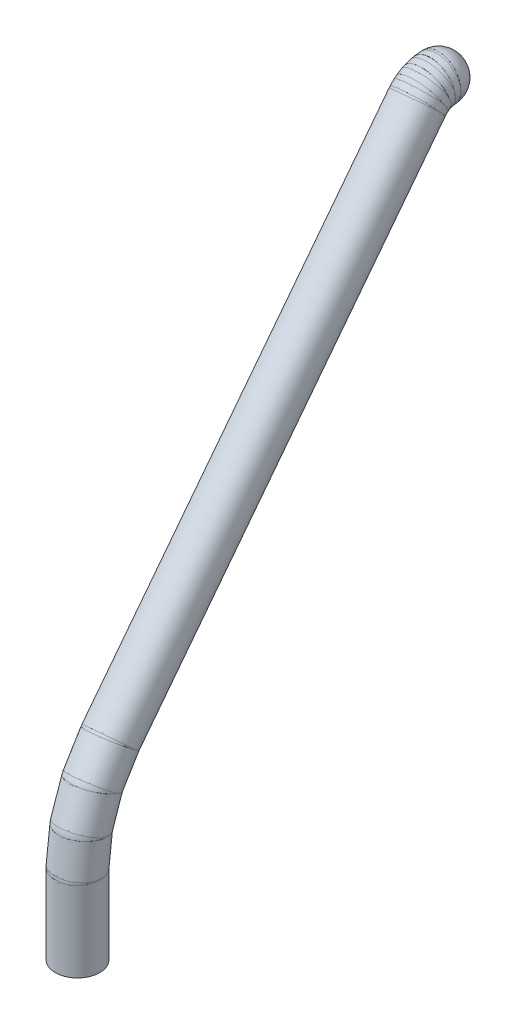
ISO-10303-21;
HEADER;
FILE_DESCRIPTION(('STEP AP214'),'2;1');
FILE_NAME('part.step','',(''),(''),'','','');
FILE_SCHEMA(('AUTOMOTIVE_DESIGN { 1 0 10303 214 1 1 1 1 }'));
ENDSEC;
DATA;
#1=APPLICATION_CONTEXT('core data for automotive mechanical design processes');
#2=APPLICATION_PROTOCOL_DEFINITION('international standard','automotive_design',2000,#1);
#3=PRODUCT_CONTEXT('',#1,'mechanical');
#4=PRODUCT('Part','Part','',(#3));
#5=PRODUCT_RELATED_PRODUCT_CATEGORY('part','',(#4));
#6=PRODUCT_DEFINITION_FORMATION('','',#4);
#7=PRODUCT_DEFINITION_CONTEXT('part definition',#1,'design');
#8=PRODUCT_DEFINITION('design','',#6,#7);
#9=PRODUCT_DEFINITION_SHAPE('','',#8);
#10=(LENGTH_UNIT() NAMED_UNIT(*) SI_UNIT(.MILLI.,.METRE.));
#11=(NAMED_UNIT(*) PLANE_ANGLE_UNIT() SI_UNIT($,.RADIAN.));
#12=(NAMED_UNIT(*) SI_UNIT($,.STERADIAN.) SOLID_ANGLE_UNIT());
#13=UNCERTAINTY_MEASURE_WITH_UNIT(LENGTH_MEASURE(1.E-05),#10,'distance_accuracy_value','');
#14=(GEOMETRIC_REPRESENTATION_CONTEXT(3) GLOBAL_UNCERTAINTY_ASSIGNED_CONTEXT((#13)) GLOBAL_UNIT_ASSIGNED_CONTEXT((#10,
#11,#12)) REPRESENTATION_CONTEXT('',''));
#15=CARTESIAN_POINT('',(0.,0.,0.));
#16=DIRECTION('',(0.,0.,1.));
#17=DIRECTION('',(1.,0.,0.));
#18=AXIS2_PLACEMENT_3D('',#15,#16,#17);
#19=CARTESIAN_POINT('',(30.,-101.2,256.));
#20=DIRECTION('',(0.,1.,0.));
#21=DIRECTION('',(1.,0.,0.));
#22=AXIS2_PLACEMENT_3D('',#19,#20,#21);
#23=PLANE('',#22);
#24=CARTESIAN_POINT('',(30.,-101.2,256.));
#25=DIRECTION('',(0.,1.,0.));
#26=DIRECTION('',(0.,0.,1.));
#27=AXIS2_PLACEMENT_3D('',#24,#25,#26);
#28=CIRCLE('',#27,2.5);
#29=CARTESIAN_POINT('',(30.,-101.2,258.5));
#30=VERTEX_POINT('',#29);
#31=EDGE_CURVE('P0_E10',#30,#30,#28,.T.);
#32=ORIENTED_EDGE('',*,*,#31,.F.);
#33=EDGE_LOOP('',(#32));
#34=FACE_BOUND('',#33,.T.);
#35=ADVANCED_FACE('P0_F15',(#34),#23,.F.);
#36=CARTESIAN_POINT('',(30.,-92.17247960699,256.));
#37=DIRECTION('',(0.,1.,0.));
#38=DIRECTION('',(1.,0.,0.));
#39=AXIS2_PLACEMENT_3D('',#36,#37,#38);
#40=PLANE('',#39);
#41=CARTESIAN_POINT('',(30.,-92.17247960699,256.));
#42=DIRECTION('',(0.,1.,0.));
#43=DIRECTION('',(0.,0.,1.));
#44=AXIS2_PLACEMENT_3D('',#41,#42,#43);
#45=CIRCLE('',#44,2.5);
#46=CARTESIAN_POINT('',(30.,-92.17247960699,258.5));
#47=VERTEX_POINT('',#46);
#48=EDGE_CURVE('P0_E39',#47,#47,#45,.T.);
#49=ORIENTED_EDGE('',*,*,#48,.T.);
#50=EDGE_LOOP('',(#49));
#51=FACE_BOUND('',#50,.T.);
#52=ADVANCED_FACE('P0_F42',(#51),#40,.T.);
#53=CARTESIAN_POINT('',(30.,-101.2,256.));
#54=DIRECTION('',(0.,1.,0.));
#55=DIRECTION('',(0.,0.,1.));
#56=AXIS2_PLACEMENT_3D('',#53,#54,#55);
#57=CYLINDRICAL_SURFACE('',#56,2.5);
#58=ORIENTED_EDGE('',*,*,#48,.F.);
#59=DIRECTION('',(0.,1.,0.));
#60=VECTOR('',#59,1.);
#61=CARTESIAN_POINT('',(30.,-101.2,258.5));
#62=LINE('',#61,#60);
#63=EDGE_CURVE('P0_E24',#30,#47,#62,.T.);
#64=ORIENTED_EDGE('',*,*,#63,.F.);
#65=ORIENTED_EDGE('',*,*,#31,.T.);
#66=ORIENTED_EDGE('',*,*,#63,.T.);
#67=EDGE_LOOP('',(#58,#64,#65,#66));
#68=FACE_BOUND('',#67,.T.);
#69=ADVANCED_FACE('P0_F17',(#68),#57,.T.);
#70=CLOSED_SHELL('',(#35,#52,#69));
#71=MANIFOLD_SOLID_BREP('P0_B1',#70);
#72=CARTESIAN_POINT('',(30.,-92.17247960699,256.));
#73=DIRECTION('',(-0.0126773422459009,0.992033754658075,-0.125332815386009));
#74=DIRECTION('',(-0.994923319263172,0.,0.100635921948139));
#75=AXIS2_PLACEMENT_3D('',#72,#73,#74);
#76=PLANE('',#75);
#77=CARTESIAN_POINT('',(30.,-92.17247960699,256.));
#78=DIRECTION('',(-0.0126773422459009,0.99203375465811,-0.125332815385731));
#79=DIRECTION('',(0.,0.125342888031981,0.992113481623852));
#80=AXIS2_PLACEMENT_3D('',#77,#78,#79);
#81=CIRCLE('',#80,2.5);
#82=CARTESIAN_POINT('',(30.,-91.85912238691,258.48028370406));
#83=VERTEX_POINT('',#82);
#84=EDGE_CURVE('P1_E11',#83,#83,#81,.T.);
#85=ORIENTED_EDGE('',*,*,#84,.F.);
#86=EDGE_LOOP('',(#85));
#87=FACE_BOUND('',#86,.T.);
#88=ADVANCED_FACE('P1_F16',(#87),#76,.F.);
#89=CARTESIAN_POINT('',(29.952090167216,-88.42341530158,255.52634597134));
#90=DIRECTION('',(-0.0126773422459009,0.992033754658075,-0.125332815386009));
#91=DIRECTION('',(-0.994923319263172,0.,0.100635921948139));
#92=AXIS2_PLACEMENT_3D('',#89,#90,#91);
#93=PLANE('',#92);
#94=CARTESIAN_POINT('',(29.952090167216,-88.42341530158,255.52634597134));
#95=DIRECTION('',(-0.0126773422459009,0.99203375465811,-0.125332815385731));
#96=DIRECTION('',(0.,0.125342888031981,0.992113481623852));
#97=AXIS2_PLACEMENT_3D('',#94,#95,#96);
#98=CIRCLE('',#97,2.5);
#99=CARTESIAN_POINT('',(29.952090167216,-88.1100580815,258.0066296754));
#100=VERTEX_POINT('',#99);
#101=EDGE_CURVE('P1_E41',#100,#100,#98,.T.);
#102=ORIENTED_EDGE('',*,*,#101,.T.);
#103=EDGE_LOOP('',(#102));
#104=FACE_BOUND('',#103,.T.);
#105=ADVANCED_FACE('P1_F18',(#104),#93,.T.);
#106=CARTESIAN_POINT('',(30.,-92.17247960699,256.));
#107=DIRECTION('',(-0.0126773422459009,0.99203375465811,-0.125332815385731));
#108=DIRECTION('',(0.,0.125342888031981,0.992113481623852));
#109=AXIS2_PLACEMENT_3D('',#106,#107,#108);
#110=CYLINDRICAL_SURFACE('',#109,2.5);
#111=ORIENTED_EDGE('',*,*,#101,.F.);
#112=DIRECTION('',(-0.0126773422459009,0.992033754658075,-0.125332815386009));
#113=VECTOR('',#112,1.);
#114=CARTESIAN_POINT('',(30.,-91.85912238691,258.48028370406));
#115=LINE('',#114,#113);
#116=EDGE_CURVE('P1_E25',#83,#100,#115,.T.);
#117=ORIENTED_EDGE('',*,*,#116,.F.);
#118=ORIENTED_EDGE('',*,*,#84,.T.);
#119=ORIENTED_EDGE('',*,*,#116,.T.);
#120=EDGE_LOOP('',(#111,#117,#118,#119));
#121=FACE_BOUND('',#120,.T.);
#122=ADVANCED_FACE('P1_F40',(#121),#110,.T.);
#123=CLOSED_SHELL('',(#88,#105,#122));
#124=MANIFOLD_SOLID_BREP('P1_B1',#123);
#125=CARTESIAN_POINT('',(29.952090167216,-88.42341530158,255.52634597134));
#126=DIRECTION('',(-0.0372273182593311,0.929063302515528,-0.368042805518813));
#127=DIRECTION('',(-0.994923319263152,0.,0.10063592194834));
#128=AXIS2_PLACEMENT_3D('',#125,#126,#127);
#129=PLANE('',#128);
#130=CARTESIAN_POINT('',(29.952090167216,-88.42341530158,255.52634597134));
#131=DIRECTION('',(-0.0372273182593311,0.929063302515526,-0.368042805518817));
#132=DIRECTION('',(0.,0.368298101239983,0.929707754416958));
#133=AXIS2_PLACEMENT_3D('',#130,#131,#132);
#134=CIRCLE('',#133,2.5);
#135=CARTESIAN_POINT('',(29.952090167216,-87.50267004848,257.85061535738));
#136=VERTEX_POINT('',#135);
#137=EDGE_CURVE('P2_E11',#136,#136,#134,.T.);
#138=ORIENTED_EDGE('',*,*,#137,.F.);
#139=EDGE_LOOP('',(#138));
#140=FACE_BOUND('',#139,.T.);
#141=ADVANCED_FACE('P2_F16',(#140),#129,.F.);
#142=CARTESIAN_POINT('',(29.811401799087,-84.9123270462,254.1354496046));
#143=DIRECTION('',(-0.0372273182593311,0.929063302515528,-0.368042805518813));
#144=DIRECTION('',(-0.994923319263152,0.,0.10063592194834));
#145=AXIS2_PLACEMENT_3D('',#142,#143,#144);
#146=PLANE('',#145);
#147=CARTESIAN_POINT('',(29.811401799087,-84.9123270462,254.1354496046));
#148=DIRECTION('',(-0.0372273182593311,0.929063302515526,-0.368042805518817));
#149=DIRECTION('',(0.,0.368298101239983,0.929707754416958));
#150=AXIS2_PLACEMENT_3D('',#147,#148,#149);
#151=CIRCLE('',#150,2.5);
#152=CARTESIAN_POINT('',(29.811401799087,-83.9915817931,256.45971899065));
#153=VERTEX_POINT('',#152);
#154=EDGE_CURVE('P2_E41',#153,#153,#151,.T.);
#155=ORIENTED_EDGE('',*,*,#154,.T.);
#156=EDGE_LOOP('',(#155));
#157=FACE_BOUND('',#156,.T.);
#158=ADVANCED_FACE('P2_F18',(#157),#146,.T.);
#159=CARTESIAN_POINT('',(29.952090167216,-88.42341530158,255.52634597134));
#160=DIRECTION('',(-0.0372273182593311,0.929063302515526,-0.368042805518817));
#161=DIRECTION('',(0.,0.368298101239983,0.929707754416958));
#162=AXIS2_PLACEMENT_3D('',#159,#160,#161);
#163=CYLINDRICAL_SURFACE('',#162,2.5);
#164=ORIENTED_EDGE('',*,*,#154,.F.);
#165=DIRECTION('',(-0.0372273182593311,0.929063302515528,-0.368042805518813));
#166=VECTOR('',#165,1.);
#167=CARTESIAN_POINT('',(29.952090167216,-87.50267004848,257.85061535738));
#168=LINE('',#167,#166);
#169=EDGE_CURVE('P2_E20',#136,#153,#168,.T.);
#170=ORIENTED_EDGE('',*,*,#169,.F.);
#171=ORIENTED_EDGE('',*,*,#137,.T.);
#172=ORIENTED_EDGE('',*,*,#169,.T.);
#173=EDGE_LOOP('',(#164,#170,#171,#172));
#174=FACE_BOUND('',#173,.T.);
#175=ADVANCED_FACE('P2_F40',(#174),#163,.T.);
#176=CLOSED_SHELL('',(#141,#158,#175));
#177=MANIFOLD_SOLID_BREP('P2_B1',#176);
#178=CARTESIAN_POINT('',(29.811401799087,-84.9123270462,254.1354496046));
#179=DIRECTION('',(-0.0594142486084648,0.807119518111336,-0.587390866924245));
#180=DIRECTION('',(-0.994923319263134,0.,0.100635921948515));
#181=AXIS2_PLACEMENT_3D('',#178,#179,#180);
#182=PLANE('',#181);
#183=CARTESIAN_POINT('',(29.811401799087,-84.9123270462,254.1354496046));
#184=DIRECTION('',(-0.0594142486084648,0.807119518111208,-0.587390866924421));
#185=DIRECTION('',(0.,0.588430380316118,0.808547888205163));
#186=AXIS2_PLACEMENT_3D('',#183,#184,#185);
#187=CIRCLE('',#186,2.5);
#188=CARTESIAN_POINT('',(29.811401799087,-83.44125109541,256.15681932512));
#189=VERTEX_POINT('',#188);
#190=EDGE_CURVE('P3_E11',#189,#189,#187,.T.);
#191=ORIENTED_EDGE('',*,*,#190,.F.);
#192=EDGE_LOOP('',(#191));
#193=FACE_BOUND('',#192,.T.);
#194=ADVANCED_FACE('P3_F16',(#193),#182,.F.);
#195=CARTESIAN_POINT('',(29.586865247135,-81.86208509492,251.91559960236));
#196=DIRECTION('',(-0.0594142486084648,0.807119518111336,-0.587390866924245));
#197=DIRECTION('',(-0.994923319263134,0.,0.100635921948515));
#198=AXIS2_PLACEMENT_3D('',#195,#196,#197);
#199=PLANE('',#198);
#200=CARTESIAN_POINT('',(29.586865247135,-81.86208509492,251.91559960236));
#201=DIRECTION('',(-0.0594142486084648,0.807119518111208,-0.587390866924421));
#202=DIRECTION('',(0.,0.588430380316118,0.808547888205163));
#203=AXIS2_PLACEMENT_3D('',#200,#201,#202);
#204=CIRCLE('',#203,2.5);
#205=CARTESIAN_POINT('',(29.586865247135,-80.39100914413,253.93696932287));
#206=VERTEX_POINT('',#205);
#207=EDGE_CURVE('P3_E40',#206,#206,#204,.T.);
#208=ORIENTED_EDGE('',*,*,#207,.T.);
#209=EDGE_LOOP('',(#208));
#210=FACE_BOUND('',#209,.T.);
#211=ADVANCED_FACE('P3_F44',(#210),#199,.T.);
#212=CARTESIAN_POINT('',(29.811401799087,-84.9123270462,254.1354496046));
#213=DIRECTION('',(-0.0594142486084648,0.807119518111208,-0.587390866924421));
#214=DIRECTION('',(0.,0.588430380316118,0.808547888205163));
#215=AXIS2_PLACEMENT_3D('',#212,#213,#214);
#216=CYLINDRICAL_SURFACE('',#215,2.5);
#217=ORIENTED_EDGE('',*,*,#207,.F.);
#218=DIRECTION('',(-0.0594142486084648,0.807119518111336,-0.587390866924245));
#219=VECTOR('',#218,1.);
#220=CARTESIAN_POINT('',(29.811401799087,-83.44125109541,256.15681932512));
#221=LINE('',#220,#219);
#222=EDGE_CURVE('P3_E25',#189,#206,#221,.T.);
#223=ORIENTED_EDGE('',*,*,#222,.F.);
#224=ORIENTED_EDGE('',*,*,#190,.T.);
#225=ORIENTED_EDGE('',*,*,#222,.T.);
#226=EDGE_LOOP('',(#217,#223,#224,#225));
#227=FACE_BOUND('',#226,.T.);
#228=ADVANCED_FACE('P3_F18',(#227),#216,.T.);
#229=CLOSED_SHELL('',(#194,#211,#228));
#230=MANIFOLD_SOLID_BREP('P3_B1',#229);
#231=CARTESIAN_POINT('',(29.586865247135,-81.86208509492,251.91559960236));
#232=DIRECTION('',(-0.0691730704917026,0.726317240162447,-0.683870128724421));
#233=DIRECTION('',(-0.994923319263135,0.,0.100635921948509));
#234=AXIS2_PLACEMENT_3D('',#231,#232,#233);
#235=PLANE('',#234);
#236=CARTESIAN_POINT('',(29.586865247135,-81.86208509492,251.91559960236));
#237=DIRECTION('',(-0.0691730704917026,0.726317240162072,-0.683870128724819));
#238=DIRECTION('',(0.,0.685512153558017,0.728061183778018));
#239=AXIS2_PLACEMENT_3D('',#236,#237,#238);
#240=CIRCLE('',#239,2.5);
#241=CARTESIAN_POINT('',(29.586865247135,-80.14830471102,253.7357525618));
#242=VERTEX_POINT('',#241);
#243=EDGE_CURVE('P4_E11',#242,#242,#240,.T.);
#244=ORIENTED_EDGE('',*,*,#243,.F.);
#245=EDGE_LOOP('',(#244));
#246=FACE_BOUND('',#245,.T.);
#247=ADVANCED_FACE('P4_F16',(#246),#235,.F.);
#248=CARTESIAN_POINT('',(25.701684413623,-41.06768634303,213.50528908922));
#249=DIRECTION('',(-0.0691730704917026,0.726317240162447,-0.683870128724421));
#250=DIRECTION('',(-0.994923319263135,0.,0.100635921948509));
#251=AXIS2_PLACEMENT_3D('',#248,#249,#250);
#252=PLANE('',#251);
#253=CARTESIAN_POINT('',(25.701684413623,-41.06768634303,213.50528908922));
#254=DIRECTION('',(-0.0691730704917026,0.726317240162072,-0.683870128724819));
#255=DIRECTION('',(0.,0.685512153558017,0.728061183778018));
#256=AXIS2_PLACEMENT_3D('',#253,#254,#255);
#257=CIRCLE('',#256,2.5);
#258=CARTESIAN_POINT('',(25.701684413623,-39.35390595914,215.32544204867));
#259=VERTEX_POINT('',#258);
#260=EDGE_CURVE('P4_E20',#259,#259,#257,.T.);
#261=ORIENTED_EDGE('',*,*,#260,.T.);
#262=EDGE_LOOP('',(#261));
#263=FACE_BOUND('',#262,.T.);
#264=ADVANCED_FACE('P4_F44',(#263),#252,.T.);
#265=CARTESIAN_POINT('',(29.586865247135,-81.86208509492,251.91559960236));
#266=DIRECTION('',(-0.0691730704917026,0.726317240162072,-0.683870128724819));
#267=DIRECTION('',(0.,0.685512153558017,0.728061183778018));
#268=AXIS2_PLACEMENT_3D('',#265,#266,#267);
#269=CYLINDRICAL_SURFACE('',#268,2.5);
#270=ORIENTED_EDGE('',*,*,#260,.F.);
#271=DIRECTION('',(-0.0691730704917026,0.726317240162447,-0.683870128724421));
#272=VECTOR('',#271,1.);
#273=CARTESIAN_POINT('',(29.586865247135,-80.14830471102,253.7357525618));
#274=LINE('',#273,#272);
#275=EDGE_CURVE('P4_E27',#242,#259,#274,.T.);
#276=ORIENTED_EDGE('',*,*,#275,.F.);
#277=ORIENTED_EDGE('',*,*,#243,.T.);
#278=ORIENTED_EDGE('',*,*,#275,.T.);
#279=EDGE_LOOP('',(#270,#276,#277,#278));
#280=FACE_BOUND('',#279,.T.);
#281=ADVANCED_FACE('P4_F18',(#280),#269,.T.);
#282=CLOSED_SHELL('',(#247,#264,#281));
#283=MANIFOLD_SOLID_BREP('P4_B1',#282);
#284=CARTESIAN_POINT('',(25.701684413623,-41.06768634303,213.50528908922));
#285=DIRECTION('',(-0.0621960375123115,0.653058393879226,-0.754749221332261));
#286=DIRECTION('',(-0.99662180243427,0.,0.0821278449289072));
#287=AXIS2_PLACEMENT_3D('',#284,#285,#286);
#288=PLANE('',#287);
#289=CARTESIAN_POINT('',(25.701684413623,-41.06768634303,213.50528908922));
#290=DIRECTION('',(-0.0621960375123115,0.653058393879173,-0.754749221332306));
#291=DIRECTION('',(0.,-0.756213286311936,-0.654325198662945));
#292=AXIS2_PLACEMENT_3D('',#289,#290,#291);
#293=CIRCLE('',#292,2.5);
#294=CARTESIAN_POINT('',(25.701684413623,-42.95821955881,211.86947609256));
#295=VERTEX_POINT('',#294);
#296=EDGE_CURVE('P5_E11',#295,#295,#293,.T.);
#297=ORIENTED_EDGE('',*,*,#296,.F.);
#298=EDGE_LOOP('',(#297));
#299=FACE_BOUND('',#298,.T.);
#300=ADVANCED_FACE('P5_F16',(#299),#288,.F.);
#301=CARTESIAN_POINT('',(25.658621685792,-40.61552770081,212.98272267505));
#302=DIRECTION('',(-0.0621960375123115,0.653058393879226,-0.754749221332261));
#303=DIRECTION('',(-0.99662180243427,0.,0.0821278449289072));
#304=AXIS2_PLACEMENT_3D('',#301,#302,#303);
#305=PLANE('',#304);
#306=CARTESIAN_POINT('',(25.658621685792,-40.61552770081,212.98272267505));
#307=DIRECTION('',(-0.0621960375123115,0.653058393879173,-0.754749221332306));
#308=DIRECTION('',(0.,-0.756213286311936,-0.654325198662945));
#309=AXIS2_PLACEMENT_3D('',#306,#307,#308);
#310=CIRCLE('',#309,2.5);
#311=CARTESIAN_POINT('',(25.658621685792,-42.50606091659,211.34690967839));
#312=VERTEX_POINT('',#311);
#313=EDGE_CURVE('P5_E20',#312,#312,#310,.T.);
#314=ORIENTED_EDGE('',*,*,#313,.T.);
#315=EDGE_LOOP('',(#314));
#316=FACE_BOUND('',#315,.T.);
#317=ADVANCED_FACE('P5_F18',(#316),#305,.T.);
#318=CARTESIAN_POINT('',(25.701684413623,-41.06768634303,213.50528908922));
#319=DIRECTION('',(-0.0621960375123115,0.653058393879173,-0.754749221332306));
#320=DIRECTION('',(0.,-0.756213286311936,-0.654325198662945));
#321=AXIS2_PLACEMENT_3D('',#318,#319,#320);
#322=CYLINDRICAL_SURFACE('',#321,2.5);
#323=ORIENTED_EDGE('',*,*,#313,.F.);
#324=DIRECTION('',(-0.0621960375123115,0.653058393879226,-0.754749221332261));
#325=VECTOR('',#324,1.);
#326=CARTESIAN_POINT('',(25.701684413623,-42.95821955881,211.86947609256));
#327=LINE('',#326,#325);
#328=EDGE_CURVE('P5_E26',#295,#312,#327,.T.);
#329=ORIENTED_EDGE('',*,*,#328,.F.);
#330=ORIENTED_EDGE('',*,*,#296,.T.);
#331=ORIENTED_EDGE('',*,*,#328,.T.);
#332=EDGE_LOOP('',(#323,#329,#330,#331));
#333=FACE_BOUND('',#332,.T.);
#334=ADVANCED_FACE('P5_F41',(#333),#322,.T.);
#335=CLOSED_SHELL('',(#300,#317,#334));
#336=MANIFOLD_SOLID_BREP('P5_B1',#335);
#337=CARTESIAN_POINT('',(25.658621685792,-40.61552770081,212.98272267505));
#338=DIRECTION('',(-0.0463737208152911,0.486924068560222,-0.872212376359397));
#339=DIRECTION('',(-0.998589575527841,0.,0.0530929340602554));
#340=AXIS2_PLACEMENT_3D('',#337,#338,#339);
#341=PLANE('',#340);
#342=CARTESIAN_POINT('',(25.658621685792,-40.61552770081,212.98272267505));
#343=DIRECTION('',(-0.0463737208152911,0.486924068560178,-0.872212376359421));
#344=DIRECTION('',(0.,-0.873151747679518,-0.487448484995289));
#345=AXIS2_PLACEMENT_3D('',#342,#343,#344);
#346=CIRCLE('',#345,2.5);
#347=CARTESIAN_POINT('',(25.658621685792,-42.79840707001,211.76410146256));
#348=VERTEX_POINT('',#347);
#349=EDGE_CURVE('P6_E11',#348,#348,#346,.T.);
#350=ORIENTED_EDGE('',*,*,#349,.F.);
#351=EDGE_LOOP('',(#350));
#352=FACE_BOUND('',#351,.T.);
#353=ADVANCED_FACE('P6_F16',(#352),#341,.F.);
#354=CARTESIAN_POINT('',(25.626513869959,-40.27839563457,212.37882818794));
#355=DIRECTION('',(-0.0463737208152911,0.486924068560222,-0.872212376359397));
#356=DIRECTION('',(-0.998589575527841,0.,0.0530929340602554));
#357=AXIS2_PLACEMENT_3D('',#354,#355,#356);
#358=PLANE('',#357);
#359=CARTESIAN_POINT('',(25.626513869959,-40.27839563457,212.37882818794));
#360=DIRECTION('',(-0.0463737208152911,0.486924068560178,-0.872212376359421));
#361=DIRECTION('',(0.,-0.873151747679518,-0.487448484995289));
#362=AXIS2_PLACEMENT_3D('',#359,#360,#361);
#363=CIRCLE('',#362,2.5);
#364=CARTESIAN_POINT('',(25.626513869959,-42.46127500377,211.16020697545));
#365=VERTEX_POINT('',#364);
#366=EDGE_CURVE('P6_E40',#365,#365,#363,.T.);
#367=ORIENTED_EDGE('',*,*,#366,.T.);
#368=EDGE_LOOP('',(#367));
#369=FACE_BOUND('',#368,.T.);
#370=ADVANCED_FACE('P6_F44',(#369),#358,.T.);
#371=CARTESIAN_POINT('',(25.658621685792,-40.61552770081,212.98272267505));
#372=DIRECTION('',(-0.0463737208152911,0.486924068560178,-0.872212376359421));
#373=DIRECTION('',(0.,-0.873151747679518,-0.487448484995289));
#374=AXIS2_PLACEMENT_3D('',#371,#372,#373);
#375=CYLINDRICAL_SURFACE('',#374,2.5);
#376=ORIENTED_EDGE('',*,*,#366,.F.);
#377=DIRECTION('',(-0.0463737208152911,0.486924068560222,-0.872212376359397));
#378=VECTOR('',#377,1.);
#379=CARTESIAN_POINT('',(25.658621685792,-42.79840707001,211.76410146256));
#380=LINE('',#379,#378);
#381=EDGE_CURVE('P6_E25',#348,#365,#380,.T.);
#382=ORIENTED_EDGE('',*,*,#381,.F.);
#383=ORIENTED_EDGE('',*,*,#349,.T.);
#384=ORIENTED_EDGE('',*,*,#381,.T.);
#385=EDGE_LOOP('',(#376,#382,#383,#384));
#386=FACE_BOUND('',#385,.T.);
#387=ADVANCED_FACE('P6_F18',(#386),#375,.T.);
#388=CLOSED_SHELL('',(#353,#370,#387));
#389=MANIFOLD_SOLID_BREP('P6_B1',#388);
#390=CARTESIAN_POINT('',(25.626513869959,-40.27839563457,212.37882818794));
#391=DIRECTION('',(-0.0286200057702501,0.300510060587106,-0.953349148400336));
#392=DIRECTION('',(-0.999549689530442,0.,0.0300069685172678));
#393=AXIS2_PLACEMENT_3D('',#390,#391,#392);
#394=PLANE('',#393);
#395=CARTESIAN_POINT('',(25.626513869959,-40.27839563457,212.37882818794));
#396=DIRECTION('',(-0.02862000577025,0.300510060587077,-0.953349148400345));
#397=DIRECTION('',(0.,-0.953739834825094,-0.300633210853029));
#398=AXIS2_PLACEMENT_3D('',#395,#396,#397);
#399=CIRCLE('',#398,2.5);
#400=CARTESIAN_POINT('',(25.626513869959,-42.66274522163,211.6272451608));
#401=VERTEX_POINT('',#400);
#402=EDGE_CURVE('P7_E11',#401,#401,#399,.T.);
#403=ORIENTED_EDGE('',*,*,#402,.F.);
#404=EDGE_LOOP('',(#403));
#405=FACE_BOUND('',#404,.T.);
#406=ADVANCED_FACE('P7_F16',(#405),#394,.F.);
#407=CARTESIAN_POINT('',(25.606698210179,-40.07033120688,211.71875695917));
#408=DIRECTION('',(-0.0286200057702501,0.300510060587106,-0.953349148400336));
#409=DIRECTION('',(-0.999549689530442,0.,0.0300069685172678));
#410=AXIS2_PLACEMENT_3D('',#407,#408,#409);
#411=PLANE('',#410);
#412=CARTESIAN_POINT('',(25.606698210179,-40.07033120688,211.71875695917));
#413=DIRECTION('',(-0.02862000577025,0.300510060587077,-0.953349148400345));
#414=DIRECTION('',(0.,-0.953739834825094,-0.300633210853029));
#415=AXIS2_PLACEMENT_3D('',#412,#413,#414);
#416=CIRCLE('',#415,2.5);
#417=CARTESIAN_POINT('',(25.606698210179,-42.45468079394,210.96717393203));
#418=VERTEX_POINT('',#417);
#419=EDGE_CURVE('P7_E41',#418,#418,#416,.T.);
#420=ORIENTED_EDGE('',*,*,#419,.T.);
#421=EDGE_LOOP('',(#420));
#422=FACE_BOUND('',#421,.T.);
#423=ADVANCED_FACE('P7_F18',(#422),#411,.T.);
#424=CARTESIAN_POINT('',(25.626513869959,-40.27839563457,212.37882818794));
#425=DIRECTION('',(-0.02862000577025,0.300510060587077,-0.953349148400345));
#426=DIRECTION('',(0.,-0.953739834825094,-0.300633210853029));
#427=AXIS2_PLACEMENT_3D('',#424,#425,#426);
#428=CYLINDRICAL_SURFACE('',#427,2.5);
#429=ORIENTED_EDGE('',*,*,#419,.F.);
#430=DIRECTION('',(-0.0286200057702501,0.300510060587106,-0.953349148400336));
#431=VECTOR('',#430,1.);
#432=CARTESIAN_POINT('',(25.626513869959,-42.66274522163,211.6272451608));
#433=LINE('',#432,#431);
#434=EDGE_CURVE('P7_E20',#401,#418,#433,.T.);
#435=ORIENTED_EDGE('',*,*,#434,.F.);
#436=ORIENTED_EDGE('',*,*,#402,.T.);
#437=ORIENTED_EDGE('',*,*,#434,.T.);
#438=EDGE_LOOP('',(#429,#435,#436,#437));
#439=FACE_BOUND('',#438,.T.);
#440=ADVANCED_FACE('P7_F40',(#439),#428,.T.);
#441=CLOSED_SHELL('',(#406,#423,#440));
#442=MANIFOLD_SOLID_BREP('P7_B1',#441);
#443=CARTESIAN_POINT('',(25.606698210179,-40.07033120688,211.71875695917));
#444=DIRECTION('',(-0.00967430891107494,0.101580243565957,-0.994780308341582));
#445=DIRECTION('',(-0.999952714853183,0.,0.00972461093051308));
#446=AXIS2_PLACEMENT_3D('',#443,#444,#445);
#447=PLANE('',#446);
#448=CARTESIAN_POINT('',(25.606698210179,-40.07033120688,211.71875695917));
#449=DIRECTION('',(-0.00967430891107494,0.101580243566335,-0.994780308341544));
#450=DIRECTION('',(0.,-0.994826863474572,-0.101584997461956));
#451=AXIS2_PLACEMENT_3D('',#448,#449,#450);
#452=CIRCLE('',#451,2.5);
#453=CARTESIAN_POINT('',(25.606698210179,-42.55739836557,211.46479446551));
#454=VERTEX_POINT('',#453);
#455=EDGE_CURVE('P8_E11',#454,#454,#452,.T.);
#456=ORIENTED_EDGE('',*,*,#455,.F.);
#457=EDGE_LOOP('',(#456));
#458=FACE_BOUND('',#457,.T.);
#459=ADVANCED_FACE('P8_F16',(#458),#447,.F.);
#460=CARTESIAN_POINT('',(25.6,-40.,211.03));
#461=DIRECTION('',(-0.00967430891107494,0.101580243565957,-0.994780308341582));
#462=DIRECTION('',(-0.999952714853183,0.,0.00972461093051308));
#463=AXIS2_PLACEMENT_3D('',#460,#461,#462);
#464=PLANE('',#463);
#465=CARTESIAN_POINT('',(25.6,-40.,211.03));
#466=DIRECTION('',(-0.00967430891107494,0.101580243566335,-0.994780308341544));
#467=DIRECTION('',(0.,-0.994826863474572,-0.101584997461956));
#468=AXIS2_PLACEMENT_3D('',#465,#466,#467);
#469=CIRCLE('',#468,2.5);
#470=CARTESIAN_POINT('',(25.6,-42.48706715868,210.77603750634));
#471=VERTEX_POINT('',#470);
#472=EDGE_CURVE('P8_E41',#471,#471,#469,.T.);
#473=ORIENTED_EDGE('',*,*,#472,.T.);
#474=EDGE_LOOP('',(#473));
#475=FACE_BOUND('',#474,.T.);
#476=ADVANCED_FACE('P8_F44',(#475),#464,.T.);
#477=CARTESIAN_POINT('',(25.606698210179,-40.07033120688,211.71875695917));
#478=DIRECTION('',(-0.00967430891107494,0.101580243566335,-0.994780308341544));
#479=DIRECTION('',(0.,-0.994826863474572,-0.101584997461956));
#480=AXIS2_PLACEMENT_3D('',#477,#478,#479);
#481=CYLINDRICAL_SURFACE('',#480,2.5);
#482=ORIENTED_EDGE('',*,*,#472,.F.);
#483=DIRECTION('',(-0.00967430891107494,0.101580243565957,-0.994780308341582));
#484=VECTOR('',#483,1.);
#485=CARTESIAN_POINT('',(25.606698210179,-42.55739836557,211.46479446551));
#486=LINE('',#485,#484);
#487=EDGE_CURVE('P8_E20',#454,#471,#486,.T.);
#488=ORIENTED_EDGE('',*,*,#487,.F.);
#489=ORIENTED_EDGE('',*,*,#455,.T.);
#490=ORIENTED_EDGE('',*,*,#487,.T.);
#491=EDGE_LOOP('',(#482,#488,#489,#490));
#492=FACE_BOUND('',#491,.T.);
#493=ADVANCED_FACE('P8_F18',(#492),#481,.T.);
#494=CLOSED_SHELL('',(#459,#476,#493));
#495=MANIFOLD_SOLID_BREP('P8_B1',#494);
#496=CARTESIAN_POINT('',(25.6,-40.,211.03));
#497=DIRECTION('',(0.,0.,-1.));
#498=DIRECTION('',(0.,-1.,0.));
#499=AXIS2_PLACEMENT_3D('',#496,#497,#498);
#500=PLANE('',#499);
#501=CARTESIAN_POINT('',(25.6,-40.,211.03));
#502=DIRECTION('',(0.,0.,-1.));
#503=DIRECTION('',(-1.,0.,0.));
#504=AXIS2_PLACEMENT_3D('',#501,#502,#503);
#505=CIRCLE('',#504,2.5);
#506=CARTESIAN_POINT('',(23.1,-40.,211.03));
#507=VERTEX_POINT('',#506);
#508=EDGE_CURVE('P9_E11',#507,#507,#505,.T.);
#509=ORIENTED_EDGE('',*,*,#508,.F.);
#510=EDGE_LOOP('',(#509));
#511=FACE_BOUND('',#510,.T.);
#512=ADVANCED_FACE('P9_F16',(#511),#500,.F.);
#513=CARTESIAN_POINT('',(25.6,-40.,211.));
#514=DIRECTION('',(0.,0.,-1.));
#515=DIRECTION('',(0.,-1.,0.));
#516=AXIS2_PLACEMENT_3D('',#513,#514,#515);
#517=PLANE('',#516);
#518=CARTESIAN_POINT('',(25.6,-40.,211.));
#519=DIRECTION('',(0.,0.,-1.));
#520=DIRECTION('',(-1.,0.,0.));
#521=AXIS2_PLACEMENT_3D('',#518,#519,#520);
#522=CIRCLE('',#521,2.5);
#523=CARTESIAN_POINT('',(23.1,-40.,211.));
#524=VERTEX_POINT('',#523);
#525=EDGE_CURVE('P9_E40',#524,#524,#522,.T.);
#526=ORIENTED_EDGE('',*,*,#525,.T.);
#527=EDGE_LOOP('',(#526));
#528=FACE_BOUND('',#527,.T.);
#529=ADVANCED_FACE('P9_F44',(#528),#517,.T.);
#530=CARTESIAN_POINT('',(25.6,-40.,211.03));
#531=DIRECTION('',(0.,0.,-1.));
#532=DIRECTION('',(-1.,0.,0.));
#533=AXIS2_PLACEMENT_3D('',#530,#531,#532);
#534=CYLINDRICAL_SURFACE('',#533,2.5);
#535=ORIENTED_EDGE('',*,*,#525,.F.);
#536=DIRECTION('',(0.,0.,-1.));
#537=VECTOR('',#536,1.);
#538=CARTESIAN_POINT('',(23.1,-40.,211.03));
#539=LINE('',#538,#537);
#540=EDGE_CURVE('P9_E25',#507,#524,#539,.T.);
#541=ORIENTED_EDGE('',*,*,#540,.F.);
#542=ORIENTED_EDGE('',*,*,#508,.T.);
#543=ORIENTED_EDGE('',*,*,#540,.T.);
#544=EDGE_LOOP('',(#535,#541,#542,#543));
#545=FACE_BOUND('',#544,.T.);
#546=ADVANCED_FACE('P9_F18',(#545),#534,.T.);
#547=CLOSED_SHELL('',(#512,#529,#546));
#548=MANIFOLD_SOLID_BREP('P9_B1',#547);
#549=CARTESIAN_POINT('',(30.,-92.17247960699,256.));
#550=DIRECTION('',(0.,0.,1.));
#551=DIRECTION('',(1.,0.,0.));
#552=AXIS2_PLACEMENT_3D('',#549,#550,#551);
#553=SPHERICAL_SURFACE('',#552,2.5);
#554=CARTESIAN_POINT('',(30.,-92.17247960699,253.5));
#555=VERTEX_POINT('',#554);
#556=VERTEX_LOOP('',#555);
#557=FACE_BOUND('',#556,.T.);
#558=ADVANCED_FACE('P10_F14',(#557),#553,.T.);
#559=CLOSED_SHELL('',(#558));
#560=MANIFOLD_SOLID_BREP('P10_B1',#559);
#561=CARTESIAN_POINT('',(29.952090167216,-88.42341530158,255.52634597134));
#562=DIRECTION('',(0.,0.,1.));
#563=DIRECTION('',(1.,0.,0.));
#564=AXIS2_PLACEMENT_3D('',#561,#562,#563);
#565=SPHERICAL_SURFACE('',#564,2.5);
#566=CARTESIAN_POINT('',(29.952090167216,-88.42341530158,253.02634597134));
#567=VERTEX_POINT('',#566);
#568=VERTEX_LOOP('',#567);
#569=FACE_BOUND('',#568,.T.);
#570=ADVANCED_FACE('P11_F14',(#569),#565,.T.);
#571=CLOSED_SHELL('',(#570));
#572=MANIFOLD_SOLID_BREP('P11_B1',#571);
#573=CARTESIAN_POINT('',(29.811401799087,-84.9123270462,254.1354496046));
#574=DIRECTION('',(0.,0.,1.));
#575=DIRECTION('',(1.,0.,0.));
#576=AXIS2_PLACEMENT_3D('',#573,#574,#575);
#577=SPHERICAL_SURFACE('',#576,2.5);
#578=CARTESIAN_POINT('',(29.811401799087,-84.9123270462,251.6354496046));
#579=VERTEX_POINT('',#578);
#580=VERTEX_LOOP('',#579);
#581=FACE_BOUND('',#580,.T.);
#582=ADVANCED_FACE('P12_F14',(#581),#577,.T.);
#583=CLOSED_SHELL('',(#582));
#584=MANIFOLD_SOLID_BREP('P12_B1',#583);
#585=CARTESIAN_POINT('',(29.586865247135,-81.86208509492,251.91559960236));
#586=DIRECTION('',(0.,0.,1.));
#587=DIRECTION('',(1.,0.,0.));
#588=AXIS2_PLACEMENT_3D('',#585,#586,#587);
#589=SPHERICAL_SURFACE('',#588,2.5);
#590=CARTESIAN_POINT('',(29.586865247135,-81.86208509492,249.41559960236));
#591=VERTEX_POINT('',#590);
#592=VERTEX_LOOP('',#591);
#593=FACE_BOUND('',#592,.T.);
#594=ADVANCED_FACE('P13_F14',(#593),#589,.T.);
#595=CLOSED_SHELL('',(#594));
#596=MANIFOLD_SOLID_BREP('P13_B1',#595);
#597=CARTESIAN_POINT('',(25.701684413623,-41.06768634303,213.50528908922));
#598=DIRECTION('',(0.,0.,1.));
#599=DIRECTION('',(1.,0.,0.));
#600=AXIS2_PLACEMENT_3D('',#597,#598,#599);
#601=SPHERICAL_SURFACE('',#600,2.5);
#602=CARTESIAN_POINT('',(25.701684413623,-41.06768634303,211.00528908922));
#603=VERTEX_POINT('',#602);
#604=VERTEX_LOOP('',#603);
#605=FACE_BOUND('',#604,.T.);
#606=ADVANCED_FACE('P14_F14',(#605),#601,.T.);
#607=CLOSED_SHELL('',(#606));
#608=MANIFOLD_SOLID_BREP('P14_B1',#607);
#609=CARTESIAN_POINT('',(25.658621685792,-40.61552770081,212.98272267505));
#610=DIRECTION('',(0.,0.,1.));
#611=DIRECTION('',(1.,0.,0.));
#612=AXIS2_PLACEMENT_3D('',#609,#610,#611);
#613=SPHERICAL_SURFACE('',#612,2.5);
#614=CARTESIAN_POINT('',(25.658621685792,-40.61552770081,210.48272267505));
#615=VERTEX_POINT('',#614);
#616=VERTEX_LOOP('',#615);
#617=FACE_BOUND('',#616,.T.);
#618=ADVANCED_FACE('P15_F14',(#617),#613,.T.);
#619=CLOSED_SHELL('',(#618));
#620=MANIFOLD_SOLID_BREP('P15_B1',#619);
#621=CARTESIAN_POINT('',(25.626513869959,-40.27839563457,212.37882818794));
#622=DIRECTION('',(0.,0.,1.));
#623=DIRECTION('',(1.,0.,0.));
#624=AXIS2_PLACEMENT_3D('',#621,#622,#623);
#625=SPHERICAL_SURFACE('',#624,2.5);
#626=CARTESIAN_POINT('',(25.626513869959,-40.27839563457,209.87882818794));
#627=VERTEX_POINT('',#626);
#628=VERTEX_LOOP('',#627);
#629=FACE_BOUND('',#628,.T.);
#630=ADVANCED_FACE('P16_F14',(#629),#625,.T.);
#631=CLOSED_SHELL('',(#630));
#632=MANIFOLD_SOLID_BREP('P16_B1',#631);
#633=CARTESIAN_POINT('',(25.606698210179,-40.07033120688,211.71875695917));
#634=DIRECTION('',(0.,0.,1.));
#635=DIRECTION('',(1.,0.,0.));
#636=AXIS2_PLACEMENT_3D('',#633,#634,#635);
#637=SPHERICAL_SURFACE('',#636,2.5);
#638=CARTESIAN_POINT('',(25.606698210179,-40.07033120688,209.21875695917));
#639=VERTEX_POINT('',#638);
#640=VERTEX_LOOP('',#639);
#641=FACE_BOUND('',#640,.T.);
#642=ADVANCED_FACE('P17_F14',(#641),#637,.T.);
#643=CLOSED_SHELL('',(#642));
#644=MANIFOLD_SOLID_BREP('P17_B1',#643);
#645=CARTESIAN_POINT('',(25.6,-40.,211.03));
#646=DIRECTION('',(0.,0.,1.));
#647=DIRECTION('',(1.,0.,0.));
#648=AXIS2_PLACEMENT_3D('',#645,#646,#647);
#649=SPHERICAL_SURFACE('',#648,2.5);
#650=CARTESIAN_POINT('',(25.6,-40.,208.53));
#651=VERTEX_POINT('',#650);
#652=VERTEX_LOOP('',#651);
#653=FACE_BOUND('',#652,.T.);
#654=ADVANCED_FACE('P18_F13',(#653),#649,.T.);
#655=CLOSED_SHELL('',(#654));
#656=MANIFOLD_SOLID_BREP('P18_B1',#655);
#657=ADVANCED_BREP_SHAPE_REPRESENTATION('',(#18,#71,#124,#177,#230,#283,#336,#389,#442,#495,
#548,#560,#572,#584,#596,#608,#620,#632,#644,#656),#14);
#658=SHAPE_DEFINITION_REPRESENTATION(#9,#657);
ENDSEC;
END-ISO-10303-21;
